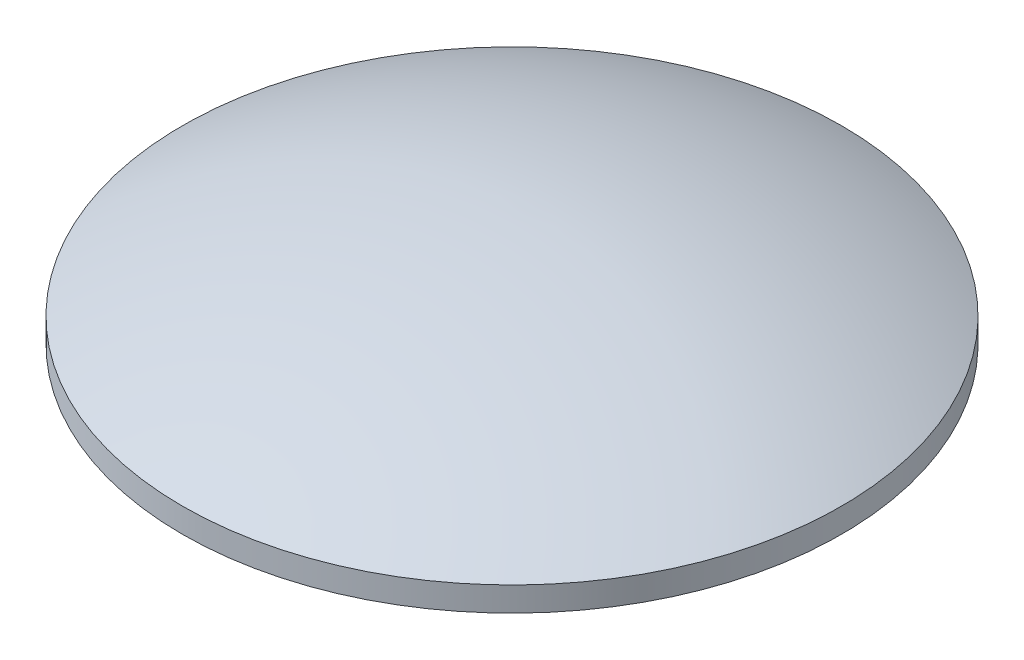
ISO-10303-21;
HEADER;
FILE_DESCRIPTION(('STEP AP214'),'2;1');
FILE_NAME('part.step','',(''),(''),'','','');
FILE_SCHEMA(('AUTOMOTIVE_DESIGN { 1 0 10303 214 1 1 1 1 }'));
ENDSEC;
DATA;
#1=APPLICATION_CONTEXT('core data for automotive mechanical design processes');
#2=APPLICATION_PROTOCOL_DEFINITION('international standard','automotive_design',2000,#1);
#3=PRODUCT_CONTEXT('',#1,'mechanical');
#4=PRODUCT('Part','Part','',(#3));
#5=PRODUCT_RELATED_PRODUCT_CATEGORY('part','',(#4));
#6=PRODUCT_DEFINITION_FORMATION('','',#4);
#7=PRODUCT_DEFINITION_CONTEXT('part definition',#1,'design');
#8=PRODUCT_DEFINITION('design','',#6,#7);
#9=PRODUCT_DEFINITION_SHAPE('','',#8);
#10=(LENGTH_UNIT() NAMED_UNIT(*) SI_UNIT(.MILLI.,.METRE.));
#11=(NAMED_UNIT(*) PLANE_ANGLE_UNIT() SI_UNIT($,.RADIAN.));
#12=(NAMED_UNIT(*) SI_UNIT($,.STERADIAN.) SOLID_ANGLE_UNIT());
#13=UNCERTAINTY_MEASURE_WITH_UNIT(LENGTH_MEASURE(1.E-05),#10,'distance_accuracy_value','');
#14=(GEOMETRIC_REPRESENTATION_CONTEXT(3) GLOBAL_UNCERTAINTY_ASSIGNED_CONTEXT((#13)) GLOBAL_UNIT_ASSIGNED_CONTEXT((#10,
#11,#12)) REPRESENTATION_CONTEXT('',''));
#15=CARTESIAN_POINT('',(0.,0.,0.));
#16=DIRECTION('',(0.,0.,1.));
#17=DIRECTION('',(1.,0.,0.));
#18=AXIS2_PLACEMENT_3D('',#15,#16,#17);
#19=CARTESIAN_POINT('',(0.,0.5,0.));
#20=DIRECTION('',(0.,-1.,0.));
#21=DIRECTION('',(0.,0.,-1.));
#22=AXIS2_PLACEMENT_3D('',#19,#20,#21);
#23=CYLINDRICAL_SURFACE('',#22,6.75);
#24=CARTESIAN_POINT('',(0.,0.5,0.));
#25=DIRECTION('',(0.,1.,0.));
#26=DIRECTION('',(0.,0.,1.));
#27=AXIS2_PLACEMENT_3D('',#24,#25,#26);
#28=CIRCLE('',#27,6.75);
#29=CARTESIAN_POINT('',(0.,0.5,6.75));
#30=VERTEX_POINT('',#29);
#31=EDGE_CURVE('E10',#30,#30,#28,.T.);
#32=ORIENTED_EDGE('',*,*,#31,.F.);
#33=EDGE_LOOP('',(#32));
#34=FACE_BOUND('',#33,.T.);
#35=CARTESIAN_POINT('',(0.,0.,0.));
#36=DIRECTION('',(0.,1.,0.));
#37=DIRECTION('',(0.,0.,1.));
#38=AXIS2_PLACEMENT_3D('',#35,#36,#37);
#39=CIRCLE('',#38,6.75);
#40=CARTESIAN_POINT('',(0.,0.,6.75));
#41=VERTEX_POINT('',#40);
#42=EDGE_CURVE('E37',#41,#41,#39,.T.);
#43=ORIENTED_EDGE('',*,*,#42,.T.);
#44=EDGE_LOOP('',(#43));
#45=FACE_BOUND('',#44,.T.);
#46=ADVANCED_FACE('F30',(#34,#45),#23,.T.);
#47=CARTESIAN_POINT('',(0.,-12.0507352941177,0.));
#48=DIRECTION('',(0.,0.,1.));
#49=DIRECTION('',(1.,0.,0.));
#50=AXIS2_PLACEMENT_3D('',#47,#48,#49);
#51=SPHERICAL_SURFACE('',#50,14.2507352941177);
#52=CARTESIAN_POINT('',(0.,-12.0507352941177,0.));
#53=DIRECTION('',(0.,1.,0.));
#54=DIRECTION('',(0.,0.,1.));
#55=AXIS2_PLACEMENT_3D('',#52,#53,#54);
#56=SPHERICAL_SURFACE('',#55,14.2507352941177);
#57=ORIENTED_EDGE('',*,*,#31,.T.);
#58=EDGE_LOOP('',(#57));
#59=FACE_BOUND('',#58,.T.);
#60=ADVANCED_FACE('F32',(#59),#56,.T.);
#61=CARTESIAN_POINT('',(0.,0.,0.));
#62=DIRECTION('',(0.,1.,0.));
#63=DIRECTION('',(0.,0.,1.));
#64=AXIS2_PLACEMENT_3D('',#61,#62,#63);
#65=PLANE('',#64);
#66=ORIENTED_EDGE('',*,*,#42,.F.);
#67=EDGE_LOOP('',(#66));
#68=FACE_BOUND('',#67,.T.);
#69=ADVANCED_FACE('F44',(#68),#65,.F.);
#70=CLOSED_SHELL('',(#46,#60,#69));
#71=MANIFOLD_SOLID_BREP('B2',#70);
#72=ADVANCED_BREP_SHAPE_REPRESENTATION('',(#18,#71),#14);
#73=SHAPE_DEFINITION_REPRESENTATION(#9,#72);
ENDSEC;
END-ISO-10303-21;
